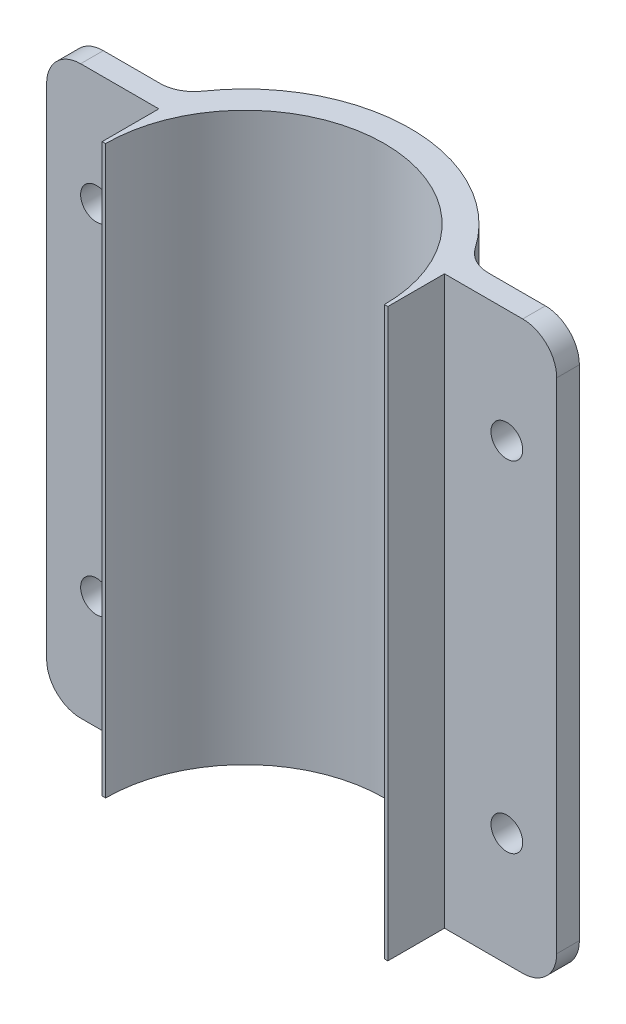
ISO-10303-21;
HEADER;
FILE_DESCRIPTION(('STEP AP214'),'2;1');
FILE_NAME('part.step','',(''),(''),'','','');
FILE_SCHEMA(('AUTOMOTIVE_DESIGN { 1 0 10303 214 1 1 1 1 }'));
ENDSEC;
DATA;
#1=APPLICATION_CONTEXT('core data for automotive mechanical design processes');
#2=APPLICATION_PROTOCOL_DEFINITION('international standard','automotive_design',2000,#1);
#3=PRODUCT_CONTEXT('',#1,'mechanical');
#4=PRODUCT('Part','Part','',(#3));
#5=PRODUCT_RELATED_PRODUCT_CATEGORY('part','',(#4));
#6=PRODUCT_DEFINITION_FORMATION('','',#4);
#7=PRODUCT_DEFINITION_CONTEXT('part definition',#1,'design');
#8=PRODUCT_DEFINITION('design','',#6,#7);
#9=PRODUCT_DEFINITION_SHAPE('','',#8);
#10=(LENGTH_UNIT() NAMED_UNIT(*) SI_UNIT(.MILLI.,.METRE.));
#11=(NAMED_UNIT(*) PLANE_ANGLE_UNIT() SI_UNIT($,.RADIAN.));
#12=(NAMED_UNIT(*) SI_UNIT($,.STERADIAN.) SOLID_ANGLE_UNIT());
#13=UNCERTAINTY_MEASURE_WITH_UNIT(LENGTH_MEASURE(1.E-05),#10,'distance_accuracy_value','');
#14=(GEOMETRIC_REPRESENTATION_CONTEXT(3) GLOBAL_UNCERTAINTY_ASSIGNED_CONTEXT((#13)) GLOBAL_UNIT_ASSIGNED_CONTEXT((#10,
#11,#12)) REPRESENTATION_CONTEXT('',''));
#15=CARTESIAN_POINT('',(0.,0.,0.));
#16=DIRECTION('',(0.,0.,1.));
#17=DIRECTION('',(1.,0.,0.));
#18=AXIS2_PLACEMENT_3D('',#15,#16,#17);
#19=CARTESIAN_POINT('',(-22.5,50.,-5.));
#20=DIRECTION('',(-1.,0.,0.));
#21=DIRECTION('',(0.,0.,1.));
#22=AXIS2_PLACEMENT_3D('',#19,#20,#21);
#23=PLANE('',#22);
#24=DIRECTION('',(0.,-1.,0.));
#25=VECTOR('',#24,1.);
#26=CARTESIAN_POINT('',(-22.5,50.,-7.));
#27=LINE('',#26,#25);
#28=CARTESIAN_POINT('',(-22.5,47.,-7.));
#29=VERTEX_POINT('',#28);
#30=CARTESIAN_POINT('',(-22.5,3.,-7.));
#31=VERTEX_POINT('',#30);
#32=EDGE_CURVE('E273',#29,#31,#27,.T.);
#33=ORIENTED_EDGE('',*,*,#32,.T.);
#34=DIRECTION('',(0.,0.,-1.));
#35=VECTOR('',#34,1.);
#36=CARTESIAN_POINT('',(-22.5,3.,-5.));
#37=LINE('',#36,#35);
#38=CARTESIAN_POINT('',(-22.5,3.,-5.));
#39=VERTEX_POINT('',#38);
#40=EDGE_CURVE('E61',#31,#39,#37,.F.);
#41=ORIENTED_EDGE('',*,*,#40,.T.);
#42=DIRECTION('',(0.,-1.,0.));
#43=VECTOR('',#42,1.);
#44=CARTESIAN_POINT('',(-22.5,50.,-5.));
#45=LINE('',#44,#43);
#46=CARTESIAN_POINT('',(-22.5,47.,-5.));
#47=VERTEX_POINT('',#46);
#48=EDGE_CURVE('E277',#47,#39,#45,.T.);
#49=ORIENTED_EDGE('',*,*,#48,.F.);
#50=DIRECTION('',(0.,0.,-1.));
#51=VECTOR('',#50,1.);
#52=CARTESIAN_POINT('',(-22.5,47.,-5.));
#53=LINE('',#52,#51);
#54=EDGE_CURVE('E346',#47,#29,#53,.T.);
#55=ORIENTED_EDGE('',*,*,#54,.T.);
#56=EDGE_LOOP('',(#33,#41,#49,#55));
#57=FACE_BOUND('',#56,.T.);
#58=ADVANCED_FACE('F39',(#57),#23,.T.);
#59=CARTESIAN_POINT('',(-12.6,50.,-5.));
#60=DIRECTION('',(0.,0.,1.));
#61=DIRECTION('',(1.,0.,0.));
#62=AXIS2_PLACEMENT_3D('',#59,#60,#61);
#63=PLANE('',#62);
#64=CARTESIAN_POINT('',(-18.1,40.,-5.));
#65=DIRECTION('',(0.,0.,-1.));
#66=DIRECTION('',(-1.,0.,0.));
#67=AXIS2_PLACEMENT_3D('',#64,#65,#66);
#68=CIRCLE('',#67,1.4);
#69=CARTESIAN_POINT('',(-19.5,40.,-5.));
#70=VERTEX_POINT('',#69);
#71=EDGE_CURVE('E495',#70,#70,#68,.T.);
#72=ORIENTED_EDGE('',*,*,#71,.T.);
#73=EDGE_LOOP('',(#72));
#74=FACE_BOUND('',#73,.T.);
#75=CARTESIAN_POINT('',(-18.1,10.,-5.));
#76=DIRECTION('',(0.,0.,-1.));
#77=DIRECTION('',(1.,0.,0.));
#78=AXIS2_PLACEMENT_3D('',#75,#76,#77);
#79=CIRCLE('',#78,1.4);
#80=CARTESIAN_POINT('',(-16.7,10.,-5.));
#81=VERTEX_POINT('',#80);
#82=EDGE_CURVE('E480',#81,#81,#79,.T.);
#83=ORIENTED_EDGE('',*,*,#82,.T.);
#84=EDGE_LOOP('',(#83));
#85=FACE_BOUND('',#84,.T.);
#86=ORIENTED_EDGE('',*,*,#48,.T.);
#87=CARTESIAN_POINT('',(-19.5,3.,-5.));
#88=DIRECTION('',(0.,0.,1.));
#89=DIRECTION('',(1.,0.,0.));
#90=AXIS2_PLACEMENT_3D('',#87,#88,#89);
#91=CIRCLE('',#90,3.);
#92=CARTESIAN_POINT('',(-19.5,0.,-5.));
#93=VERTEX_POINT('',#92);
#94=EDGE_CURVE('E355',#39,#93,#91,.T.);
#95=ORIENTED_EDGE('',*,*,#94,.T.);
#96=DIRECTION('',(-1.,0.,0.));
#97=VECTOR('',#96,1.);
#98=CARTESIAN_POINT('',(-12.6,0.,-5.));
#99=LINE('',#98,#97);
#100=CARTESIAN_POINT('',(-12.6,0.,-5.));
#101=VERTEX_POINT('',#100);
#102=EDGE_CURVE('E177',#101,#93,#99,.T.);
#103=ORIENTED_EDGE('',*,*,#102,.F.);
#104=DIRECTION('',(0.,-1.,0.));
#105=VECTOR('',#104,1.);
#106=CARTESIAN_POINT('',(-12.6,50.,-5.));
#107=LINE('',#106,#105);
#108=CARTESIAN_POINT('',(-12.6,50.,-5.));
#109=VERTEX_POINT('',#108);
#110=EDGE_CURVE('E280',#109,#101,#107,.T.);
#111=ORIENTED_EDGE('',*,*,#110,.F.);
#112=DIRECTION('',(-1.,0.,0.));
#113=VECTOR('',#112,1.);
#114=CARTESIAN_POINT('',(-12.6,50.,-5.));
#115=LINE('',#114,#113);
#116=CARTESIAN_POINT('',(-19.5,50.,-5.));
#117=VERTEX_POINT('',#116);
#118=EDGE_CURVE('E186',#109,#117,#115,.T.);
#119=ORIENTED_EDGE('',*,*,#118,.T.);
#120=CARTESIAN_POINT('',(-19.5,47.,-5.));
#121=DIRECTION('',(0.,0.,1.));
#122=DIRECTION('',(1.,0.,0.));
#123=AXIS2_PLACEMENT_3D('',#120,#121,#122);
#124=CIRCLE('',#123,3.);
#125=EDGE_CURVE('E352',#117,#47,#124,.T.);
#126=ORIENTED_EDGE('',*,*,#125,.T.);
#127=EDGE_LOOP('',(#86,#95,#103,#111,#119,#126));
#128=FACE_BOUND('',#127,.T.);
#129=ADVANCED_FACE('F387',(#74,#85,#128),#63,.T.);
#130=CARTESIAN_POINT('',(-12.6,50.,0.));
#131=DIRECTION('',(-1.,0.,0.));
#132=DIRECTION('',(0.,0.,1.));
#133=AXIS2_PLACEMENT_3D('',#130,#131,#132);
#134=PLANE('',#133);
#135=DIRECTION('',(0.,0.,-1.));
#136=VECTOR('',#135,1.);
#137=CARTESIAN_POINT('',(-12.6,0.,0.));
#138=LINE('',#137,#136);
#139=CARTESIAN_POINT('',(-12.6,0.,0.));
#140=VERTEX_POINT('',#139);
#141=EDGE_CURVE('E266',#140,#101,#138,.T.);
#142=ORIENTED_EDGE('',*,*,#141,.F.);
#143=DIRECTION('',(0.,-1.,0.));
#144=VECTOR('',#143,1.);
#145=CARTESIAN_POINT('',(-12.6,50.,0.));
#146=LINE('',#145,#144);
#147=CARTESIAN_POINT('',(-12.6,50.,0.));
#148=VERTEX_POINT('',#147);
#149=EDGE_CURVE('E283',#148,#140,#146,.T.);
#150=ORIENTED_EDGE('',*,*,#149,.F.);
#151=DIRECTION('',(0.,0.,-1.));
#152=VECTOR('',#151,1.);
#153=CARTESIAN_POINT('',(-12.6,50.,0.));
#154=LINE('',#153,#152);
#155=EDGE_CURVE('E224',#148,#109,#154,.T.);
#156=ORIENTED_EDGE('',*,*,#155,.T.);
#157=ORIENTED_EDGE('',*,*,#110,.T.);
#158=EDGE_LOOP('',(#142,#150,#156,#157));
#159=FACE_BOUND('',#158,.T.);
#160=ADVANCED_FACE('F391',(#159),#134,.T.);
#161=CARTESIAN_POINT('',(-12.3,50.,0.));
#162=DIRECTION('',(0.,0.,1.));
#163=DIRECTION('',(1.,0.,0.));
#164=AXIS2_PLACEMENT_3D('',#161,#162,#163);
#165=PLANE('',#164);
#166=DIRECTION('',(-1.,0.,0.));
#167=VECTOR('',#166,1.);
#168=CARTESIAN_POINT('',(-12.3,0.,0.));
#169=LINE('',#168,#167);
#170=CARTESIAN_POINT('',(-12.3,0.,0.));
#171=VERTEX_POINT('',#170);
#172=EDGE_CURVE('E262',#171,#140,#169,.T.);
#173=ORIENTED_EDGE('',*,*,#172,.F.);
#174=DIRECTION('',(0.,-1.,0.));
#175=VECTOR('',#174,1.);
#176=CARTESIAN_POINT('',(-12.3,50.,0.));
#177=LINE('',#176,#175);
#178=CARTESIAN_POINT('',(-12.3,50.,0.));
#179=VERTEX_POINT('',#178);
#180=EDGE_CURVE('E286',#179,#171,#177,.T.);
#181=ORIENTED_EDGE('',*,*,#180,.F.);
#182=DIRECTION('',(-1.,0.,0.));
#183=VECTOR('',#182,1.);
#184=CARTESIAN_POINT('',(-12.3,50.,0.));
#185=LINE('',#184,#183);
#186=EDGE_CURVE('E220',#179,#148,#185,.T.);
#187=ORIENTED_EDGE('',*,*,#186,.T.);
#188=ORIENTED_EDGE('',*,*,#149,.T.);
#189=EDGE_LOOP('',(#173,#181,#187,#188));
#190=FACE_BOUND('',#189,.T.);
#191=ADVANCED_FACE('F397',(#190),#165,.T.);
#192=CARTESIAN_POINT('',(0.,50.,0.));
#193=DIRECTION('',(0.,-1.,0.));
#194=DIRECTION('',(0.,0.,-1.));
#195=AXIS2_PLACEMENT_3D('',#192,#193,#194);
#196=CYLINDRICAL_SURFACE('',#195,12.3);
#197=CARTESIAN_POINT('',(0.,0.,0.));
#198=DIRECTION('',(0.,1.,0.));
#199=DIRECTION('',(0.,0.,1.));
#200=AXIS2_PLACEMENT_3D('',#197,#198,#199);
#201=CIRCLE('',#200,12.3);
#202=CARTESIAN_POINT('',(12.3,0.,0.));
#203=VERTEX_POINT('',#202);
#204=EDGE_CURVE('E258',#203,#171,#201,.T.);
#205=ORIENTED_EDGE('',*,*,#204,.F.);
#206=DIRECTION('',(0.,-1.,0.));
#207=VECTOR('',#206,1.);
#208=CARTESIAN_POINT('',(12.3,50.,0.));
#209=LINE('',#208,#207);
#210=CARTESIAN_POINT('',(12.3,50.,0.));
#211=VERTEX_POINT('',#210);
#212=EDGE_CURVE('E289',#211,#203,#209,.T.);
#213=ORIENTED_EDGE('',*,*,#212,.F.);
#214=CARTESIAN_POINT('',(0.,50.,0.));
#215=DIRECTION('',(0.,1.,0.));
#216=DIRECTION('',(0.,0.,1.));
#217=AXIS2_PLACEMENT_3D('',#214,#215,#216);
#218=CIRCLE('',#217,12.3);
#219=EDGE_CURVE('E216',#211,#179,#218,.T.);
#220=ORIENTED_EDGE('',*,*,#219,.T.);
#221=ORIENTED_EDGE('',*,*,#180,.T.);
#222=EDGE_LOOP('',(#205,#213,#220,#221));
#223=FACE_BOUND('',#222,.T.);
#224=ADVANCED_FACE('F400',(#223),#196,.F.);
#225=CARTESIAN_POINT('',(12.6,50.,0.));
#226=DIRECTION('',(0.,0.,1.));
#227=DIRECTION('',(1.,0.,0.));
#228=AXIS2_PLACEMENT_3D('',#225,#226,#227);
#229=PLANE('',#228);
#230=DIRECTION('',(-1.,0.,0.));
#231=VECTOR('',#230,1.);
#232=CARTESIAN_POINT('',(12.6,0.,0.));
#233=LINE('',#232,#231);
#234=CARTESIAN_POINT('',(12.6,0.,0.));
#235=VERTEX_POINT('',#234);
#236=EDGE_CURVE('E254',#235,#203,#233,.T.);
#237=ORIENTED_EDGE('',*,*,#236,.F.);
#238=DIRECTION('',(0.,-1.,0.));
#239=VECTOR('',#238,1.);
#240=CARTESIAN_POINT('',(12.6,50.,0.));
#241=LINE('',#240,#239);
#242=CARTESIAN_POINT('',(12.6,50.,0.));
#243=VERTEX_POINT('',#242);
#244=EDGE_CURVE('E292',#243,#235,#241,.T.);
#245=ORIENTED_EDGE('',*,*,#244,.F.);
#246=DIRECTION('',(-1.,0.,0.));
#247=VECTOR('',#246,1.);
#248=CARTESIAN_POINT('',(12.6,50.,0.));
#249=LINE('',#248,#247);
#250=EDGE_CURVE('E212',#243,#211,#249,.T.);
#251=ORIENTED_EDGE('',*,*,#250,.T.);
#252=ORIENTED_EDGE('',*,*,#212,.T.);
#253=EDGE_LOOP('',(#237,#245,#251,#252));
#254=FACE_BOUND('',#253,.T.);
#255=ADVANCED_FACE('F404',(#254),#229,.T.);
#256=CARTESIAN_POINT('',(12.6,50.,-5.));
#257=DIRECTION('',(1.,0.,0.));
#258=DIRECTION('',(0.,0.,-1.));
#259=AXIS2_PLACEMENT_3D('',#256,#257,#258);
#260=PLANE('',#259);
#261=DIRECTION('',(0.,0.,1.));
#262=VECTOR('',#261,1.);
#263=CARTESIAN_POINT('',(12.6,0.,-5.));
#264=LINE('',#263,#262);
#265=CARTESIAN_POINT('',(12.6,0.,-5.));
#266=VERTEX_POINT('',#265);
#267=EDGE_CURVE('E250',#266,#235,#264,.T.);
#268=ORIENTED_EDGE('',*,*,#267,.F.);
#269=DIRECTION('',(0.,-1.,0.));
#270=VECTOR('',#269,1.);
#271=CARTESIAN_POINT('',(12.6,50.,-5.));
#272=LINE('',#271,#270);
#273=CARTESIAN_POINT('',(12.6,50.,-5.));
#274=VERTEX_POINT('',#273);
#275=EDGE_CURVE('E295',#274,#266,#272,.T.);
#276=ORIENTED_EDGE('',*,*,#275,.F.);
#277=DIRECTION('',(0.,0.,1.));
#278=VECTOR('',#277,1.);
#279=CARTESIAN_POINT('',(12.6,50.,-5.));
#280=LINE('',#279,#278);
#281=EDGE_CURVE('E208',#274,#243,#280,.T.);
#282=ORIENTED_EDGE('',*,*,#281,.T.);
#283=ORIENTED_EDGE('',*,*,#244,.T.);
#284=EDGE_LOOP('',(#268,#276,#282,#283));
#285=FACE_BOUND('',#284,.T.);
#286=ADVANCED_FACE('F407',(#285),#260,.T.);
#287=CARTESIAN_POINT('',(12.6,50.,-5.));
#288=DIRECTION('',(0.,0.,-1.));
#289=DIRECTION('',(-1.,0.,0.));
#290=AXIS2_PLACEMENT_3D('',#287,#288,#289);
#291=PLANE('',#290);
#292=CARTESIAN_POINT('',(18.1,10.,-5.));
#293=DIRECTION('',(0.,0.,-1.));
#294=DIRECTION('',(-1.,0.,0.));
#295=AXIS2_PLACEMENT_3D('',#292,#293,#294);
#296=CIRCLE('',#295,1.4);
#297=CARTESIAN_POINT('',(16.7,10.,-5.));
#298=VERTEX_POINT('',#297);
#299=EDGE_CURVE('E486',#298,#298,#296,.T.);
#300=ORIENTED_EDGE('',*,*,#299,.T.);
#301=EDGE_LOOP('',(#300));
#302=FACE_BOUND('',#301,.T.);
#303=CARTESIAN_POINT('',(18.1,40.,-5.));
#304=DIRECTION('',(0.,0.,-1.));
#305=DIRECTION('',(1.,0.,0.));
#306=AXIS2_PLACEMENT_3D('',#303,#304,#305);
#307=CIRCLE('',#306,1.4);
#308=CARTESIAN_POINT('',(19.5,40.,-5.));
#309=VERTEX_POINT('',#308);
#310=EDGE_CURVE('E233',#309,#309,#307,.T.);
#311=ORIENTED_EDGE('',*,*,#310,.T.);
#312=EDGE_LOOP('',(#311));
#313=FACE_BOUND('',#312,.T.);
#314=DIRECTION('',(1.,0.,0.));
#315=VECTOR('',#314,1.);
#316=CARTESIAN_POINT('',(12.6,0.,-5.));
#317=LINE('',#316,#315);
#318=CARTESIAN_POINT('',(19.5,0.,-5.));
#319=VERTEX_POINT('',#318);
#320=EDGE_CURVE('E246',#266,#319,#317,.T.);
#321=ORIENTED_EDGE('',*,*,#320,.T.);
#322=CARTESIAN_POINT('',(19.5,3.,-5.));
#323=DIRECTION('',(0.,0.,-1.));
#324=DIRECTION('',(-1.,0.,0.));
#325=AXIS2_PLACEMENT_3D('',#322,#323,#324);
#326=CIRCLE('',#325,3.);
#327=CARTESIAN_POINT('',(22.5,3.,-5.));
#328=VERTEX_POINT('',#327);
#329=EDGE_CURVE('E338',#319,#328,#326,.F.);
#330=ORIENTED_EDGE('',*,*,#329,.T.);
#331=DIRECTION('',(0.,-1.,0.));
#332=VECTOR('',#331,1.);
#333=CARTESIAN_POINT('',(22.5,50.,-5.));
#334=LINE('',#333,#332);
#335=CARTESIAN_POINT('',(22.5,47.,-5.));
#336=VERTEX_POINT('',#335);
#337=EDGE_CURVE('E298',#336,#328,#334,.T.);
#338=ORIENTED_EDGE('',*,*,#337,.F.);
#339=CARTESIAN_POINT('',(19.5,47.,-5.));
#340=DIRECTION('',(0.,0.,-1.));
#341=DIRECTION('',(-1.,0.,0.));
#342=AXIS2_PLACEMENT_3D('',#339,#340,#341);
#343=CIRCLE('',#342,3.);
#344=CARTESIAN_POINT('',(19.5,50.,-5.));
#345=VERTEX_POINT('',#344);
#346=EDGE_CURVE('E335',#336,#345,#343,.F.);
#347=ORIENTED_EDGE('',*,*,#346,.T.);
#348=DIRECTION('',(1.,0.,0.));
#349=VECTOR('',#348,1.);
#350=CARTESIAN_POINT('',(12.6,50.,-5.));
#351=LINE('',#350,#349);
#352=EDGE_CURVE('E204',#274,#345,#351,.T.);
#353=ORIENTED_EDGE('',*,*,#352,.F.);
#354=ORIENTED_EDGE('',*,*,#275,.T.);
#355=EDGE_LOOP('',(#321,#330,#338,#347,#353,#354));
#356=FACE_BOUND('',#355,.T.);
#357=ADVANCED_FACE('F410',(#302,#313,#356),#291,.F.);
#358=CARTESIAN_POINT('',(22.5,50.,-5.));
#359=DIRECTION('',(-1.,0.,0.));
#360=DIRECTION('',(0.,0.,1.));
#361=AXIS2_PLACEMENT_3D('',#358,#359,#360);
#362=PLANE('',#361);
#363=ORIENTED_EDGE('',*,*,#337,.T.);
#364=DIRECTION('',(0.,0.,-1.));
#365=VECTOR('',#364,1.);
#366=CARTESIAN_POINT('',(22.5,3.,-5.));
#367=LINE('',#366,#365);
#368=CARTESIAN_POINT('',(22.5,3.,-7.));
#369=VERTEX_POINT('',#368);
#370=EDGE_CURVE('E318',#328,#369,#367,.T.);
#371=ORIENTED_EDGE('',*,*,#370,.T.);
#372=DIRECTION('',(0.,-1.,0.));
#373=VECTOR('',#372,1.);
#374=CARTESIAN_POINT('',(22.5,50.,-7.));
#375=LINE('',#374,#373);
#376=CARTESIAN_POINT('',(22.5,47.,-7.));
#377=VERTEX_POINT('',#376);
#378=EDGE_CURVE('E302',#377,#369,#375,.T.);
#379=ORIENTED_EDGE('',*,*,#378,.F.);
#380=DIRECTION('',(0.,0.,-1.));
#381=VECTOR('',#380,1.);
#382=CARTESIAN_POINT('',(22.5,47.,-5.));
#383=LINE('',#382,#381);
#384=EDGE_CURVE('E276',#377,#336,#383,.F.);
#385=ORIENTED_EDGE('',*,*,#384,.T.);
#386=EDGE_LOOP('',(#363,#371,#379,#385));
#387=FACE_BOUND('',#386,.T.);
#388=ADVANCED_FACE('F414',(#387),#362,.F.);
#389=CARTESIAN_POINT('',(22.5,50.,-7.));
#390=DIRECTION('',(0.,0.,1.));
#391=DIRECTION('',(1.,0.,0.));
#392=AXIS2_PLACEMENT_3D('',#389,#390,#391);
#393=PLANE('',#392);
#394=CARTESIAN_POINT('',(18.1,10.,-7.));
#395=DIRECTION('',(0.,0.,-1.));
#396=DIRECTION('',(-1.,0.,0.));
#397=AXIS2_PLACEMENT_3D('',#394,#395,#396);
#398=CIRCLE('',#397,1.4);
#399=CARTESIAN_POINT('',(16.7,10.,-7.));
#400=VERTEX_POINT('',#399);
#401=EDGE_CURVE('E491',#400,#400,#398,.T.);
#402=ORIENTED_EDGE('',*,*,#401,.F.);
#403=EDGE_LOOP('',(#402));
#404=FACE_BOUND('',#403,.T.);
#405=CARTESIAN_POINT('',(18.1,40.,-7.));
#406=DIRECTION('',(0.,0.,-1.));
#407=DIRECTION('',(1.,0.,0.));
#408=AXIS2_PLACEMENT_3D('',#405,#406,#407);
#409=CIRCLE('',#408,1.4);
#410=CARTESIAN_POINT('',(19.5,40.,-7.));
#411=VERTEX_POINT('',#410);
#412=EDGE_CURVE('E490',#411,#411,#409,.T.);
#413=ORIENTED_EDGE('',*,*,#412,.F.);
#414=EDGE_LOOP('',(#413));
#415=FACE_BOUND('',#414,.T.);
#416=ORIENTED_EDGE('',*,*,#378,.T.);
#417=CARTESIAN_POINT('',(19.5,3.,-7.));
#418=DIRECTION('',(0.,0.,1.));
#419=DIRECTION('',(1.,0.,0.));
#420=AXIS2_PLACEMENT_3D('',#417,#418,#419);
#421=CIRCLE('',#420,3.);
#422=CARTESIAN_POINT('',(19.5,0.,-7.));
#423=VERTEX_POINT('',#422);
#424=EDGE_CURVE('E325',#369,#423,#421,.F.);
#425=ORIENTED_EDGE('',*,*,#424,.T.);
#426=DIRECTION('',(-1.,0.,0.));
#427=VECTOR('',#426,1.);
#428=CARTESIAN_POINT('',(22.5,0.,-7.));
#429=LINE('',#428,#427);
#430=CARTESIAN_POINT('',(14.4830935921853,0.,-7.));
#431=VERTEX_POINT('',#430);
#432=EDGE_CURVE('E243',#423,#431,#429,.T.);
#433=ORIENTED_EDGE('',*,*,#432,.T.);
#434=DIRECTION('',(0.,-1.,0.));
#435=VECTOR('',#434,1.);
#436=CARTESIAN_POINT('',(14.4830935921853,50.,-7.));
#437=LINE('',#436,#435);
#438=CARTESIAN_POINT('',(14.4830935921853,50.,-7.));
#439=VERTEX_POINT('',#438);
#440=EDGE_CURVE('E306',#439,#431,#437,.T.);
#441=ORIENTED_EDGE('',*,*,#440,.F.);
#442=DIRECTION('',(-1.,0.,0.));
#443=VECTOR('',#442,1.);
#444=CARTESIAN_POINT('',(22.1,50.,-7.));
#445=LINE('',#444,#443);
#446=CARTESIAN_POINT('',(19.5,50.,-7.));
#447=VERTEX_POINT('',#446);
#448=EDGE_CURVE('E201',#447,#439,#445,.T.);
#449=ORIENTED_EDGE('',*,*,#448,.F.);
#450=CARTESIAN_POINT('',(19.5,47.,-7.));
#451=DIRECTION('',(0.,0.,1.));
#452=DIRECTION('',(1.,0.,0.));
#453=AXIS2_PLACEMENT_3D('',#450,#451,#452);
#454=CIRCLE('',#453,3.);
#455=EDGE_CURVE('E322',#447,#377,#454,.F.);
#456=ORIENTED_EDGE('',*,*,#455,.T.);
#457=EDGE_LOOP('',(#416,#425,#433,#441,#449,#456));
#458=FACE_BOUND('',#457,.T.);
#459=ADVANCED_FACE('F367',(#404,#415,#458),#393,.F.);
#460=CARTESIAN_POINT('',(14.4830935921853,50.,-10.));
#461=DIRECTION('',(0.,-1.,0.));
#462=DIRECTION('',(0.,0.,-1.));
#463=AXIS2_PLACEMENT_3D('',#460,#461,#462);
#464=CYLINDRICAL_SURFACE('',#463,3.);
#465=CARTESIAN_POINT('',(14.4830935921853,0.,-10.));
#466=DIRECTION('',(0.,-1.,0.));
#467=DIRECTION('',(0.,0.,-1.));
#468=AXIS2_PLACEMENT_3D('',#465,#466,#467);
#469=CIRCLE('',#468,3.);
#470=CARTESIAN_POINT('',(12.0143844571537,0.,-8.29545454545454));
#471=VERTEX_POINT('',#470);
#472=EDGE_CURVE('E240',#431,#471,#469,.T.);
#473=ORIENTED_EDGE('',*,*,#472,.T.);
#474=DIRECTION('',(0.,-1.,0.));
#475=VECTOR('',#474,1.);
#476=CARTESIAN_POINT('',(12.0143844571537,50.,-8.29545454545454));
#477=LINE('',#476,#475);
#478=CARTESIAN_POINT('',(12.0143844571537,50.,-8.29545454545454));
#479=VERTEX_POINT('',#478);
#480=EDGE_CURVE('E310',#479,#471,#477,.T.);
#481=ORIENTED_EDGE('',*,*,#480,.F.);
#482=CARTESIAN_POINT('',(14.4830935921853,50.,-10.));
#483=DIRECTION('',(0.,-1.,0.));
#484=DIRECTION('',(0.,0.,-1.));
#485=AXIS2_PLACEMENT_3D('',#482,#483,#484);
#486=CIRCLE('',#485,3.);
#487=EDGE_CURVE('E195',#439,#479,#486,.T.);
#488=ORIENTED_EDGE('',*,*,#487,.F.);
#489=ORIENTED_EDGE('',*,*,#440,.T.);
#490=EDGE_LOOP('',(#473,#481,#488,#489));
#491=FACE_BOUND('',#490,.T.);
#492=ADVANCED_FACE('F374',(#491),#464,.F.);
#493=CARTESIAN_POINT('',(0.,50.,0.));
#494=DIRECTION('',(0.,-1.,0.));
#495=DIRECTION('',(0.,0.,-1.));
#496=AXIS2_PLACEMENT_3D('',#493,#494,#495);
#497=CYLINDRICAL_SURFACE('',#496,14.6);
#498=CARTESIAN_POINT('',(0.,0.,0.));
#499=DIRECTION('',(0.,1.,0.));
#500=DIRECTION('',(0.,0.,1.));
#501=AXIS2_PLACEMENT_3D('',#498,#499,#500);
#502=CIRCLE('',#501,14.6);
#503=CARTESIAN_POINT('',(-12.0143844571537,0.,-8.29545454545454));
#504=VERTEX_POINT('',#503);
#505=EDGE_CURVE('E236',#471,#504,#502,.T.);
#506=ORIENTED_EDGE('',*,*,#505,.T.);
#507=DIRECTION('',(0.,-1.,0.));
#508=VECTOR('',#507,1.);
#509=CARTESIAN_POINT('',(-12.0143844571537,50.,-8.29545454545454));
#510=LINE('',#509,#508);
#511=CARTESIAN_POINT('',(-12.0143844571537,50.,-8.29545454545454));
#512=VERTEX_POINT('',#511);
#513=EDGE_CURVE('E185',#512,#504,#510,.T.);
#514=ORIENTED_EDGE('',*,*,#513,.F.);
#515=CARTESIAN_POINT('',(0.,50.,0.));
#516=DIRECTION('',(0.,1.,0.));
#517=DIRECTION('',(0.,0.,1.));
#518=AXIS2_PLACEMENT_3D('',#515,#516,#517);
#519=CIRCLE('',#518,14.6);
#520=EDGE_CURVE('E190',#479,#512,#519,.T.);
#521=ORIENTED_EDGE('',*,*,#520,.F.);
#522=ORIENTED_EDGE('',*,*,#480,.T.);
#523=EDGE_LOOP('',(#506,#514,#521,#522));
#524=FACE_BOUND('',#523,.T.);
#525=ADVANCED_FACE('F377',(#524),#497,.T.);
#526=CARTESIAN_POINT('',(-14.4830935921853,50.,-10.));
#527=DIRECTION('',(0.,-1.,0.));
#528=DIRECTION('',(0.,0.,-1.));
#529=AXIS2_PLACEMENT_3D('',#526,#527,#528);
#530=CYLINDRICAL_SURFACE('',#529,3.);
#531=CARTESIAN_POINT('',(-14.4830935921853,0.,-10.));
#532=DIRECTION('',(0.,1.,0.));
#533=DIRECTION('',(0.,0.,1.));
#534=AXIS2_PLACEMENT_3D('',#531,#532,#533);
#535=CIRCLE('',#534,3.);
#536=CARTESIAN_POINT('',(-14.4830935921853,0.,-7.));
#537=VERTEX_POINT('',#536);
#538=EDGE_CURVE('E183',#537,#504,#535,.T.);
#539=ORIENTED_EDGE('',*,*,#538,.F.);
#540=DIRECTION('',(0.,-1.,0.));
#541=VECTOR('',#540,1.);
#542=CARTESIAN_POINT('',(-14.4830935921853,50.,-7.));
#543=LINE('',#542,#541);
#544=CARTESIAN_POINT('',(-14.4830935921853,50.,-7.));
#545=VERTEX_POINT('',#544);
#546=EDGE_CURVE('E170',#545,#537,#543,.T.);
#547=ORIENTED_EDGE('',*,*,#546,.F.);
#548=CARTESIAN_POINT('',(-14.4830935921853,50.,-10.));
#549=DIRECTION('',(0.,1.,0.));
#550=DIRECTION('',(0.,0.,1.));
#551=AXIS2_PLACEMENT_3D('',#548,#549,#550);
#552=CIRCLE('',#551,3.);
#553=EDGE_CURVE('E176',#545,#512,#552,.T.);
#554=ORIENTED_EDGE('',*,*,#553,.T.);
#555=ORIENTED_EDGE('',*,*,#513,.T.);
#556=EDGE_LOOP('',(#539,#547,#554,#555));
#557=FACE_BOUND('',#556,.T.);
#558=ADVANCED_FACE('F181',(#557),#530,.F.);
#559=CARTESIAN_POINT('',(-22.1,50.,-7.));
#560=DIRECTION('',(0.,0.,-1.));
#561=DIRECTION('',(-1.,0.,0.));
#562=AXIS2_PLACEMENT_3D('',#559,#560,#561);
#563=PLANE('',#562);
#564=CARTESIAN_POINT('',(-18.1,40.,-7.));
#565=DIRECTION('',(0.,0.,-1.));
#566=DIRECTION('',(-1.,0.,0.));
#567=AXIS2_PLACEMENT_3D('',#564,#565,#566);
#568=CIRCLE('',#567,1.4);
#569=CARTESIAN_POINT('',(-19.5,40.,-7.));
#570=VERTEX_POINT('',#569);
#571=EDGE_CURVE('E474',#570,#570,#568,.T.);
#572=ORIENTED_EDGE('',*,*,#571,.F.);
#573=EDGE_LOOP('',(#572));
#574=FACE_BOUND('',#573,.T.);
#575=CARTESIAN_POINT('',(-18.1,10.,-7.));
#576=DIRECTION('',(0.,0.,-1.));
#577=DIRECTION('',(1.,0.,0.));
#578=AXIS2_PLACEMENT_3D('',#575,#576,#577);
#579=CIRCLE('',#578,1.4);
#580=CARTESIAN_POINT('',(-16.7,10.,-7.));
#581=VERTEX_POINT('',#580);
#582=EDGE_CURVE('E477',#581,#581,#579,.T.);
#583=ORIENTED_EDGE('',*,*,#582,.F.);
#584=EDGE_LOOP('',(#583));
#585=FACE_BOUND('',#584,.T.);
#586=DIRECTION('',(1.,0.,0.));
#587=VECTOR('',#586,1.);
#588=CARTESIAN_POINT('',(-22.1,0.,-7.));
#589=LINE('',#588,#587);
#590=CARTESIAN_POINT('',(-19.5,0.,-7.));
#591=VERTEX_POINT('',#590);
#592=EDGE_CURVE('E230',#591,#537,#589,.T.);
#593=ORIENTED_EDGE('',*,*,#592,.F.);
#594=CARTESIAN_POINT('',(-19.5,3.,-7.));
#595=DIRECTION('',(0.,0.,-1.));
#596=DIRECTION('',(-1.,0.,0.));
#597=AXIS2_PLACEMENT_3D('',#594,#595,#596);
#598=CIRCLE('',#597,3.);
#599=EDGE_CURVE('E343',#591,#31,#598,.T.);
#600=ORIENTED_EDGE('',*,*,#599,.T.);
#601=ORIENTED_EDGE('',*,*,#32,.F.);
#602=CARTESIAN_POINT('',(-19.5,47.,-7.));
#603=DIRECTION('',(0.,0.,-1.));
#604=DIRECTION('',(-1.,0.,0.));
#605=AXIS2_PLACEMENT_3D('',#602,#603,#604);
#606=CIRCLE('',#605,3.);
#607=CARTESIAN_POINT('',(-19.5,50.,-7.));
#608=VERTEX_POINT('',#607);
#609=EDGE_CURVE('E173',#29,#608,#606,.T.);
#610=ORIENTED_EDGE('',*,*,#609,.T.);
#611=DIRECTION('',(1.,0.,0.));
#612=VECTOR('',#611,1.);
#613=CARTESIAN_POINT('',(-22.5,50.,-7.));
#614=LINE('',#613,#612);
#615=EDGE_CURVE('E166',#608,#545,#614,.T.);
#616=ORIENTED_EDGE('',*,*,#615,.T.);
#617=ORIENTED_EDGE('',*,*,#546,.T.);
#618=EDGE_LOOP('',(#593,#600,#601,#610,#616,#617));
#619=FACE_BOUND('',#618,.T.);
#620=ADVANCED_FACE('F169',(#574,#585,#619),#563,.T.);
#621=CARTESIAN_POINT('',(-14.4830935921853,50.,-10.));
#622=DIRECTION('',(0.,1.,0.));
#623=DIRECTION('',(0.,0.,1.));
#624=AXIS2_PLACEMENT_3D('',#621,#622,#623);
#625=PLANE('',#624);
#626=ORIENTED_EDGE('',*,*,#615,.F.);
#627=DIRECTION('',(0.,0.,-1.));
#628=VECTOR('',#627,1.);
#629=CARTESIAN_POINT('',(-19.5,50.,-10.));
#630=LINE('',#629,#628);
#631=EDGE_CURVE('E11',#608,#117,#630,.F.);
#632=ORIENTED_EDGE('',*,*,#631,.T.);
#633=ORIENTED_EDGE('',*,*,#118,.F.);
#634=ORIENTED_EDGE('',*,*,#155,.F.);
#635=ORIENTED_EDGE('',*,*,#186,.F.);
#636=ORIENTED_EDGE('',*,*,#219,.F.);
#637=ORIENTED_EDGE('',*,*,#250,.F.);
#638=ORIENTED_EDGE('',*,*,#281,.F.);
#639=ORIENTED_EDGE('',*,*,#352,.T.);
#640=DIRECTION('',(0.,0.,-1.));
#641=VECTOR('',#640,1.);
#642=CARTESIAN_POINT('',(19.5,50.,-7.));
#643=LINE('',#642,#641);
#644=EDGE_CURVE('E48',#345,#447,#643,.T.);
#645=ORIENTED_EDGE('',*,*,#644,.T.);
#646=ORIENTED_EDGE('',*,*,#448,.T.);
#647=ORIENTED_EDGE('',*,*,#487,.T.);
#648=ORIENTED_EDGE('',*,*,#520,.T.);
#649=ORIENTED_EDGE('',*,*,#553,.F.);
#650=EDGE_LOOP('',(#626,#632,#633,#634,#635,#636,#637,#638,#639,#645,#646,#647,#648,#649));
#651=FACE_BOUND('',#650,.T.);
#652=ADVANCED_FACE('F188',(#651),#625,.T.);
#653=CARTESIAN_POINT('',(-14.4830935921853,0.,-10.));
#654=DIRECTION('',(0.,1.,0.));
#655=DIRECTION('',(0.,0.,1.));
#656=AXIS2_PLACEMENT_3D('',#653,#654,#655);
#657=PLANE('',#656);
#658=ORIENTED_EDGE('',*,*,#432,.F.);
#659=DIRECTION('',(0.,0.,-1.));
#660=VECTOR('',#659,1.);
#661=CARTESIAN_POINT('',(19.5,0.,-10.));
#662=LINE('',#661,#660);
#663=EDGE_CURVE('E332',#423,#319,#662,.F.);
#664=ORIENTED_EDGE('',*,*,#663,.T.);
#665=ORIENTED_EDGE('',*,*,#320,.F.);
#666=ORIENTED_EDGE('',*,*,#267,.T.);
#667=ORIENTED_EDGE('',*,*,#236,.T.);
#668=ORIENTED_EDGE('',*,*,#204,.T.);
#669=ORIENTED_EDGE('',*,*,#172,.T.);
#670=ORIENTED_EDGE('',*,*,#141,.T.);
#671=ORIENTED_EDGE('',*,*,#102,.T.);
#672=DIRECTION('',(0.,0.,-1.));
#673=VECTOR('',#672,1.);
#674=CARTESIAN_POINT('',(-19.5,0.,-7.));
#675=LINE('',#674,#673);
#676=EDGE_CURVE('E328',#93,#591,#675,.T.);
#677=ORIENTED_EDGE('',*,*,#676,.T.);
#678=ORIENTED_EDGE('',*,*,#592,.T.);
#679=ORIENTED_EDGE('',*,*,#538,.T.);
#680=ORIENTED_EDGE('',*,*,#505,.F.);
#681=ORIENTED_EDGE('',*,*,#472,.F.);
#682=EDGE_LOOP('',(#658,#664,#665,#666,#667,#668,#669,#670,#671,#677,#678,#679,#680,#681));
#683=FACE_BOUND('',#682,.T.);
#684=ADVANCED_FACE('F379',(#683),#657,.F.);
#685=CARTESIAN_POINT('',(-18.1,10.,-5.));
#686=DIRECTION('',(0.,0.,-1.));
#687=DIRECTION('',(-1.,0.,0.));
#688=AXIS2_PLACEMENT_3D('',#685,#686,#687);
#689=CYLINDRICAL_SURFACE('',#688,1.4);
#690=ORIENTED_EDGE('',*,*,#82,.F.);
#691=EDGE_LOOP('',(#690));
#692=FACE_BOUND('',#691,.T.);
#693=ORIENTED_EDGE('',*,*,#582,.T.);
#694=EDGE_LOOP('',(#693));
#695=FACE_BOUND('',#694,.T.);
#696=ADVANCED_FACE('F515',(#692,#695),#689,.F.);
#697=CARTESIAN_POINT('',(-18.1,40.,-5.));
#698=DIRECTION('',(0.,0.,-1.));
#699=DIRECTION('',(-1.,0.,0.));
#700=AXIS2_PLACEMENT_3D('',#697,#698,#699);
#701=CYLINDRICAL_SURFACE('',#700,1.4);
#702=ORIENTED_EDGE('',*,*,#71,.F.);
#703=EDGE_LOOP('',(#702));
#704=FACE_BOUND('',#703,.T.);
#705=ORIENTED_EDGE('',*,*,#571,.T.);
#706=EDGE_LOOP('',(#705));
#707=FACE_BOUND('',#706,.T.);
#708=ADVANCED_FACE('F509',(#704,#707),#701,.F.);
#709=CARTESIAN_POINT('',(18.1,40.,-5.));
#710=DIRECTION('',(0.,0.,-1.));
#711=DIRECTION('',(-1.,0.,0.));
#712=AXIS2_PLACEMENT_3D('',#709,#710,#711);
#713=CYLINDRICAL_SURFACE('',#712,1.4);
#714=ORIENTED_EDGE('',*,*,#310,.F.);
#715=EDGE_LOOP('',(#714));
#716=FACE_BOUND('',#715,.T.);
#717=ORIENTED_EDGE('',*,*,#412,.T.);
#718=EDGE_LOOP('',(#717));
#719=FACE_BOUND('',#718,.T.);
#720=ADVANCED_FACE('F429',(#716,#719),#713,.F.);
#721=CARTESIAN_POINT('',(18.1,10.,-5.));
#722=DIRECTION('',(0.,0.,-1.));
#723=DIRECTION('',(-1.,0.,0.));
#724=AXIS2_PLACEMENT_3D('',#721,#722,#723);
#725=CYLINDRICAL_SURFACE('',#724,1.4);
#726=ORIENTED_EDGE('',*,*,#299,.F.);
#727=EDGE_LOOP('',(#726));
#728=FACE_BOUND('',#727,.T.);
#729=ORIENTED_EDGE('',*,*,#401,.T.);
#730=EDGE_LOOP('',(#729));
#731=FACE_BOUND('',#730,.T.);
#732=ADVANCED_FACE('F421',(#728,#731),#725,.F.);
#733=CARTESIAN_POINT('',(19.5,3.,-5.));
#734=DIRECTION('',(0.,0.,-1.));
#735=DIRECTION('',(-1.,0.,0.));
#736=AXIS2_PLACEMENT_3D('',#733,#734,#735);
#737=CYLINDRICAL_SURFACE('',#736,3.);
#738=ORIENTED_EDGE('',*,*,#329,.F.);
#739=ORIENTED_EDGE('',*,*,#663,.F.);
#740=ORIENTED_EDGE('',*,*,#424,.F.);
#741=ORIENTED_EDGE('',*,*,#370,.F.);
#742=EDGE_LOOP('',(#738,#739,#740,#741));
#743=FACE_BOUND('',#742,.T.);
#744=ADVANCED_FACE('F419',(#743),#737,.T.);
#745=CARTESIAN_POINT('',(-19.5,3.,-10.));
#746=DIRECTION('',(0.,0.,1.));
#747=DIRECTION('',(1.,0.,0.));
#748=AXIS2_PLACEMENT_3D('',#745,#746,#747);
#749=CYLINDRICAL_SURFACE('',#748,3.);
#750=ORIENTED_EDGE('',*,*,#94,.F.);
#751=ORIENTED_EDGE('',*,*,#40,.F.);
#752=ORIENTED_EDGE('',*,*,#599,.F.);
#753=ORIENTED_EDGE('',*,*,#676,.F.);
#754=EDGE_LOOP('',(#750,#751,#752,#753));
#755=FACE_BOUND('',#754,.T.);
#756=ADVANCED_FACE('F384',(#755),#749,.T.);
#757=CARTESIAN_POINT('',(-19.5,47.,-5.));
#758=DIRECTION('',(0.,0.,-1.));
#759=DIRECTION('',(-1.,0.,0.));
#760=AXIS2_PLACEMENT_3D('',#757,#758,#759);
#761=CYLINDRICAL_SURFACE('',#760,3.);
#762=ORIENTED_EDGE('',*,*,#125,.F.);
#763=ORIENTED_EDGE('',*,*,#631,.F.);
#764=ORIENTED_EDGE('',*,*,#609,.F.);
#765=ORIENTED_EDGE('',*,*,#54,.F.);
#766=EDGE_LOOP('',(#762,#763,#764,#765));
#767=FACE_BOUND('',#766,.T.);
#768=ADVANCED_FACE('F427',(#767),#761,.T.);
#769=CARTESIAN_POINT('',(19.5,47.,-10.));
#770=DIRECTION('',(0.,0.,1.));
#771=DIRECTION('',(1.,0.,0.));
#772=AXIS2_PLACEMENT_3D('',#769,#770,#771);
#773=CYLINDRICAL_SURFACE('',#772,3.);
#774=ORIENTED_EDGE('',*,*,#346,.F.);
#775=ORIENTED_EDGE('',*,*,#384,.F.);
#776=ORIENTED_EDGE('',*,*,#455,.F.);
#777=ORIENTED_EDGE('',*,*,#644,.F.);
#778=EDGE_LOOP('',(#774,#775,#776,#777));
#779=FACE_BOUND('',#778,.T.);
#780=ADVANCED_FACE('F41',(#779),#773,.T.);
#781=CLOSED_SHELL('',(#58,#129,#160,#191,#224,#255,#286,#357,#388,#459,#492,#525,#558,#620,#652,
#684,#696,#708,#720,#732,#744,#756,#768,#780));
#782=MANIFOLD_SOLID_BREP('B2',#781);
#783=ADVANCED_BREP_SHAPE_REPRESENTATION('',(#18,#782),#14);
#784=SHAPE_DEFINITION_REPRESENTATION(#9,#783);
ENDSEC;
END-ISO-10303-21;
